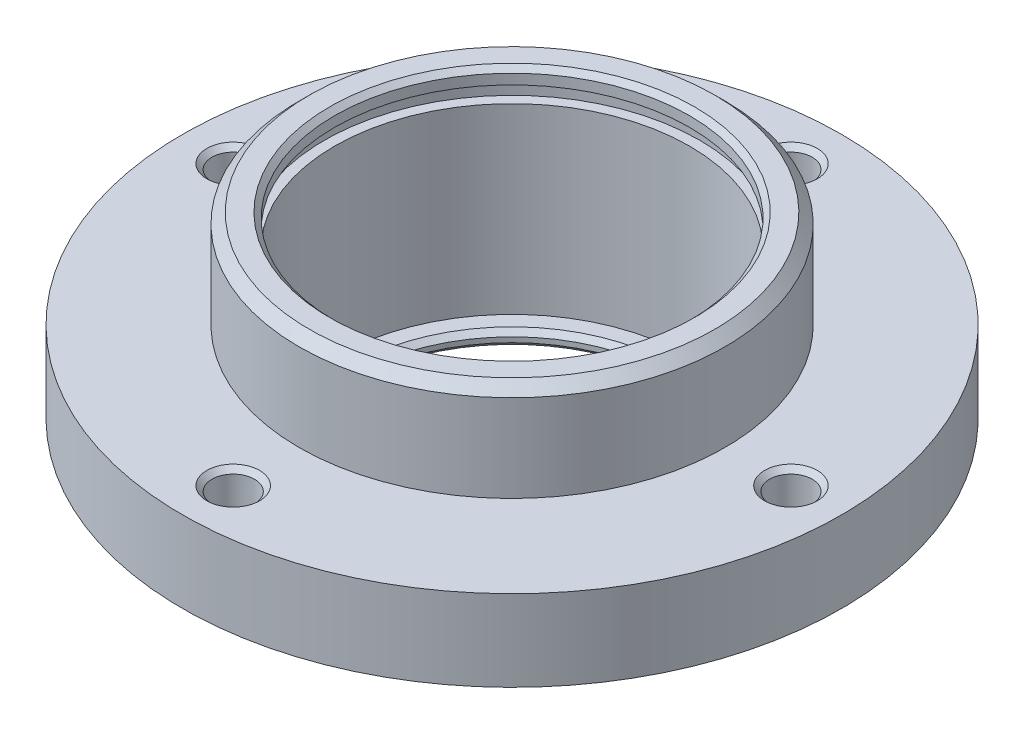
ISO-10303-21;
HEADER;
FILE_DESCRIPTION(('STEP AP214'),'2;1');
FILE_NAME('part.step','',(''),(''),'','','');
FILE_SCHEMA(('AUTOMOTIVE_DESIGN { 1 0 10303 214 1 1 1 1 }'));
ENDSEC;
DATA;
#1=APPLICATION_CONTEXT('core data for automotive mechanical design processes');
#2=APPLICATION_PROTOCOL_DEFINITION('international standard','automotive_design',2000,#1);
#3=PRODUCT_CONTEXT('',#1,'mechanical');
#4=PRODUCT('Part','Part','',(#3));
#5=PRODUCT_RELATED_PRODUCT_CATEGORY('part','',(#4));
#6=PRODUCT_DEFINITION_FORMATION('','',#4);
#7=PRODUCT_DEFINITION_CONTEXT('part definition',#1,'design');
#8=PRODUCT_DEFINITION('design','',#6,#7);
#9=PRODUCT_DEFINITION_SHAPE('','',#8);
#10=(LENGTH_UNIT() NAMED_UNIT(*) SI_UNIT(.MILLI.,.METRE.));
#11=(NAMED_UNIT(*) PLANE_ANGLE_UNIT() SI_UNIT($,.RADIAN.));
#12=(NAMED_UNIT(*) SI_UNIT($,.STERADIAN.) SOLID_ANGLE_UNIT());
#13=UNCERTAINTY_MEASURE_WITH_UNIT(LENGTH_MEASURE(1.E-05),#10,'distance_accuracy_value','');
#14=(GEOMETRIC_REPRESENTATION_CONTEXT(3) GLOBAL_UNCERTAINTY_ASSIGNED_CONTEXT((#13)) GLOBAL_UNIT_ASSIGNED_CONTEXT((#10,
#11,#12)) REPRESENTATION_CONTEXT('',''));
#15=CARTESIAN_POINT('',(0.,0.,0.));
#16=DIRECTION('',(0.,0.,1.));
#17=DIRECTION('',(1.,0.,0.));
#18=AXIS2_PLACEMENT_3D('',#15,#16,#17);
#19=CARTESIAN_POINT('',(0.,22.6,0.));
#20=DIRECTION('',(0.,-1.,0.));
#21=DIRECTION('',(0.,0.,-1.));
#22=AXIS2_PLACEMENT_3D('',#19,#20,#21);
#23=CONICAL_SURFACE('',#22,20.,0.785398163397447);
#24=CARTESIAN_POINT('',(0.,21.6,0.));
#25=DIRECTION('',(0.,-1.,0.));
#26=DIRECTION('',(0.,0.,-1.));
#27=AXIS2_PLACEMENT_3D('',#24,#25,#26);
#28=CIRCLE('',#27,21.);
#29=CARTESIAN_POINT('',(0.,21.6,-21.));
#30=VERTEX_POINT('',#29);
#31=EDGE_CURVE('E145',#30,#30,#28,.T.);
#32=ORIENTED_EDGE('',*,*,#31,.F.);
#33=EDGE_LOOP('',(#32));
#34=FACE_BOUND('',#33,.T.);
#35=CARTESIAN_POINT('',(0.,22.6,0.));
#36=DIRECTION('',(0.,-1.,0.));
#37=DIRECTION('',(0.,0.,-1.));
#38=AXIS2_PLACEMENT_3D('',#35,#36,#37);
#39=CIRCLE('',#38,20.);
#40=CARTESIAN_POINT('',(0.,22.6,-20.));
#41=VERTEX_POINT('',#40);
#42=EDGE_CURVE('E109',#41,#41,#39,.T.);
#43=ORIENTED_EDGE('',*,*,#42,.T.);
#44=EDGE_LOOP('',(#43));
#45=FACE_BOUND('',#44,.T.);
#46=ADVANCED_FACE('F35',(#34,#45),#23,.T.);
#47=CARTESIAN_POINT('',(-20.,22.6,0.));
#48=DIRECTION('',(0.,-1.,0.));
#49=DIRECTION('',(0.,0.,-1.));
#50=AXIS2_PLACEMENT_3D('',#47,#48,#49);
#51=PLANE('',#50);
#52=CARTESIAN_POINT('',(0.,22.6,0.));
#53=DIRECTION('',(0.,-1.,0.));
#54=DIRECTION('',(0.,0.,-1.));
#55=AXIS2_PLACEMENT_3D('',#52,#53,#54);
#56=CIRCLE('',#55,18.);
#57=CARTESIAN_POINT('',(0.,22.6,-18.));
#58=VERTEX_POINT('',#57);
#59=EDGE_CURVE('E94',#58,#58,#56,.T.);
#60=ORIENTED_EDGE('',*,*,#59,.T.);
#61=EDGE_LOOP('',(#60));
#62=FACE_BOUND('',#61,.T.);
#63=ORIENTED_EDGE('',*,*,#42,.F.);
#64=EDGE_LOOP('',(#63));
#65=FACE_BOUND('',#64,.T.);
#66=ADVANCED_FACE('F153',(#62,#65),#51,.F.);
#67=CARTESIAN_POINT('',(0.,0.,0.));
#68=DIRECTION('',(0.,-1.,0.));
#69=DIRECTION('',(0.,0.,-1.));
#70=AXIS2_PLACEMENT_3D('',#67,#68,#69);
#71=CYLINDRICAL_SURFACE('',#70,17.5);
#72=CARTESIAN_POINT('',(0.,22.1,0.));
#73=DIRECTION('',(0.,-1.,0.));
#74=DIRECTION('',(0.,0.,-1.));
#75=AXIS2_PLACEMENT_3D('',#72,#73,#74);
#76=CIRCLE('',#75,17.5);
#77=CARTESIAN_POINT('',(0.,22.1,-17.5));
#78=VERTEX_POINT('',#77);
#79=EDGE_CURVE('E91',#78,#78,#76,.F.);
#80=ORIENTED_EDGE('',*,*,#79,.T.);
#81=EDGE_LOOP('',(#80));
#82=FACE_BOUND('',#81,.T.);
#83=CARTESIAN_POINT('',(0.,21.1,0.));
#84=DIRECTION('',(0.,-1.,0.));
#85=DIRECTION('',(0.,0.,-1.));
#86=AXIS2_PLACEMENT_3D('',#83,#84,#85);
#87=CIRCLE('',#86,17.5);
#88=CARTESIAN_POINT('',(0.,21.1,-17.5));
#89=VERTEX_POINT('',#88);
#90=EDGE_CURVE('E112',#89,#89,#87,.T.);
#91=ORIENTED_EDGE('',*,*,#90,.T.);
#92=EDGE_LOOP('',(#91));
#93=FACE_BOUND('',#92,.T.);
#94=ADVANCED_FACE('F158',(#82,#93),#71,.F.);
#95=CARTESIAN_POINT('',(-17.5,21.1,0.));
#96=DIRECTION('',(0.,1.,0.));
#97=DIRECTION('',(0.,0.,1.));
#98=AXIS2_PLACEMENT_3D('',#95,#96,#97);
#99=PLANE('',#98);
#100=ORIENTED_EDGE('',*,*,#90,.F.);
#101=EDGE_LOOP('',(#100));
#102=FACE_BOUND('',#101,.T.);
#103=CARTESIAN_POINT('',(0.,21.1,0.));
#104=DIRECTION('',(0.,-1.,0.));
#105=DIRECTION('',(0.,0.,-1.));
#106=AXIS2_PLACEMENT_3D('',#103,#104,#105);
#107=CIRCLE('',#106,18.5);
#108=CARTESIAN_POINT('',(0.,21.1,-18.5));
#109=VERTEX_POINT('',#108);
#110=EDGE_CURVE('E115',#109,#109,#107,.T.);
#111=ORIENTED_EDGE('',*,*,#110,.T.);
#112=EDGE_LOOP('',(#111));
#113=FACE_BOUND('',#112,.T.);
#114=ADVANCED_FACE('F164',(#102,#113),#99,.F.);
#115=CARTESIAN_POINT('',(0.,0.,0.));
#116=DIRECTION('',(0.,-1.,0.));
#117=DIRECTION('',(0.,0.,-1.));
#118=AXIS2_PLACEMENT_3D('',#115,#116,#117);
#119=CYLINDRICAL_SURFACE('',#118,18.5);
#120=ORIENTED_EDGE('',*,*,#110,.F.);
#121=EDGE_LOOP('',(#120));
#122=FACE_BOUND('',#121,.T.);
#123=CARTESIAN_POINT('',(0.,19.5,0.));
#124=DIRECTION('',(0.,-1.,0.));
#125=DIRECTION('',(0.,0.,-1.));
#126=AXIS2_PLACEMENT_3D('',#123,#124,#125);
#127=CIRCLE('',#126,18.5);
#128=CARTESIAN_POINT('',(0.,19.5,-18.5));
#129=VERTEX_POINT('',#128);
#130=EDGE_CURVE('E118',#129,#129,#127,.T.);
#131=ORIENTED_EDGE('',*,*,#130,.T.);
#132=EDGE_LOOP('',(#131));
#133=FACE_BOUND('',#132,.T.);
#134=ADVANCED_FACE('F270',(#122,#133),#119,.F.);
#135=CARTESIAN_POINT('',(-17.5,19.5,0.));
#136=DIRECTION('',(0.,-1.,0.));
#137=DIRECTION('',(0.,0.,-1.));
#138=AXIS2_PLACEMENT_3D('',#135,#136,#137);
#139=PLANE('',#138);
#140=ORIENTED_EDGE('',*,*,#130,.F.);
#141=EDGE_LOOP('',(#140));
#142=FACE_BOUND('',#141,.T.);
#143=CARTESIAN_POINT('',(0.,19.5,0.));
#144=DIRECTION('',(0.,-1.,0.));
#145=DIRECTION('',(0.,0.,-1.));
#146=AXIS2_PLACEMENT_3D('',#143,#144,#145);
#147=CIRCLE('',#146,17.5);
#148=CARTESIAN_POINT('',(0.,19.5,-17.5));
#149=VERTEX_POINT('',#148);
#150=EDGE_CURVE('E121',#149,#149,#147,.T.);
#151=ORIENTED_EDGE('',*,*,#150,.T.);
#152=EDGE_LOOP('',(#151));
#153=FACE_BOUND('',#152,.T.);
#154=ADVANCED_FACE('F266',(#142,#153),#139,.F.);
#155=CARTESIAN_POINT('',(0.,0.,0.));
#156=DIRECTION('',(0.,-1.,0.));
#157=DIRECTION('',(0.,0.,-1.));
#158=AXIS2_PLACEMENT_3D('',#155,#156,#157);
#159=CYLINDRICAL_SURFACE('',#158,17.5);
#160=ORIENTED_EDGE('',*,*,#150,.F.);
#161=EDGE_LOOP('',(#160));
#162=FACE_BOUND('',#161,.T.);
#163=CARTESIAN_POINT('',(0.,1.5,0.));
#164=DIRECTION('',(0.,-1.,0.));
#165=DIRECTION('',(0.,0.,-1.));
#166=AXIS2_PLACEMENT_3D('',#163,#164,#165);
#167=CIRCLE('',#166,17.5);
#168=CARTESIAN_POINT('',(0.,1.5,-17.5));
#169=VERTEX_POINT('',#168);
#170=EDGE_CURVE('E124',#169,#169,#167,.T.);
#171=ORIENTED_EDGE('',*,*,#170,.T.);
#172=EDGE_LOOP('',(#171));
#173=FACE_BOUND('',#172,.T.);
#174=ADVANCED_FACE('F262',(#162,#173),#159,.F.);
#175=CARTESIAN_POINT('',(-17.5,1.5,0.));
#176=DIRECTION('',(0.,-1.,0.));
#177=DIRECTION('',(0.,0.,-1.));
#178=AXIS2_PLACEMENT_3D('',#175,#176,#177);
#179=PLANE('',#178);
#180=CARTESIAN_POINT('',(0.,1.5,0.));
#181=DIRECTION('',(0.,-1.,0.));
#182=DIRECTION('',(0.,0.,-1.));
#183=AXIS2_PLACEMENT_3D('',#180,#181,#182);
#184=CIRCLE('',#183,16.);
#185=CARTESIAN_POINT('',(0.,1.5,-16.));
#186=VERTEX_POINT('',#185);
#187=EDGE_CURVE('E97',#186,#186,#184,.T.);
#188=ORIENTED_EDGE('',*,*,#187,.T.);
#189=EDGE_LOOP('',(#188));
#190=FACE_BOUND('',#189,.T.);
#191=ORIENTED_EDGE('',*,*,#170,.F.);
#192=EDGE_LOOP('',(#191));
#193=FACE_BOUND('',#192,.T.);
#194=ADVANCED_FACE('F258',(#190,#193),#179,.F.);
#195=CARTESIAN_POINT('',(0.,0.,0.));
#196=DIRECTION('',(0.,-1.,0.));
#197=DIRECTION('',(0.,0.,-1.));
#198=AXIS2_PLACEMENT_3D('',#195,#196,#197);
#199=CYLINDRICAL_SURFACE('',#198,15.5);
#200=CARTESIAN_POINT('',(0.,0.500000000000023,0.));
#201=DIRECTION('',(0.,1.,0.));
#202=DIRECTION('',(0.,0.,1.));
#203=AXIS2_PLACEMENT_3D('',#200,#201,#202);
#204=CIRCLE('',#203,15.5);
#205=CARTESIAN_POINT('',(0.,0.500000000000023,15.5));
#206=VERTEX_POINT('',#205);
#207=EDGE_CURVE('E103',#206,#206,#204,.F.);
#208=ORIENTED_EDGE('',*,*,#207,.T.);
#209=EDGE_LOOP('',(#208));
#210=FACE_BOUND('',#209,.T.);
#211=CARTESIAN_POINT('',(0.,0.999999999999994,0.));
#212=DIRECTION('',(0.,-1.,0.));
#213=DIRECTION('',(0.,0.,-1.));
#214=AXIS2_PLACEMENT_3D('',#211,#212,#213);
#215=CIRCLE('',#214,15.5);
#216=CARTESIAN_POINT('',(0.,0.999999999999994,-15.5));
#217=VERTEX_POINT('',#216);
#218=EDGE_CURVE('E106',#217,#217,#215,.F.);
#219=ORIENTED_EDGE('',*,*,#218,.T.);
#220=EDGE_LOOP('',(#219));
#221=FACE_BOUND('',#220,.T.);
#222=ADVANCED_FACE('F254',(#210,#221),#199,.F.);
#223=CARTESIAN_POINT('',(-20.5,0.,0.));
#224=DIRECTION('',(0.,1.,0.));
#225=DIRECTION('',(0.,0.,1.));
#226=AXIS2_PLACEMENT_3D('',#223,#224,#225);
#227=PLANE('',#226);
#228=CARTESIAN_POINT('',(0.,0.,0.));
#229=DIRECTION('',(0.,1.,0.));
#230=DIRECTION('',(0.,0.,1.));
#231=AXIS2_PLACEMENT_3D('',#228,#229,#230);
#232=CIRCLE('',#231,16.);
#233=CARTESIAN_POINT('',(0.,0.,16.));
#234=VERTEX_POINT('',#233);
#235=EDGE_CURVE('E100',#234,#234,#232,.T.);
#236=ORIENTED_EDGE('',*,*,#235,.T.);
#237=EDGE_LOOP('',(#236));
#238=FACE_BOUND('',#237,.T.);
#239=CARTESIAN_POINT('',(0.,0.,0.));
#240=DIRECTION('',(0.,-1.,0.));
#241=DIRECTION('',(0.,0.,-1.));
#242=AXIS2_PLACEMENT_3D('',#239,#240,#241);
#243=CIRCLE('',#242,20.5);
#244=CARTESIAN_POINT('',(0.,0.,-20.5));
#245=VERTEX_POINT('',#244);
#246=EDGE_CURVE('E127',#245,#245,#243,.T.);
#247=ORIENTED_EDGE('',*,*,#246,.T.);
#248=EDGE_LOOP('',(#247));
#249=FACE_BOUND('',#248,.T.);
#250=ADVANCED_FACE('F250',(#238,#249),#227,.F.);
#251=CARTESIAN_POINT('',(0.,2.,0.));
#252=DIRECTION('',(0.,1.,0.));
#253=DIRECTION('',(0.,0.,1.));
#254=AXIS2_PLACEMENT_3D('',#251,#252,#253);
#255=CONICAL_SURFACE('',#254,22.5,0.785398163397449);
#256=ORIENTED_EDGE('',*,*,#246,.F.);
#257=EDGE_LOOP('',(#256));
#258=FACE_BOUND('',#257,.T.);
#259=CARTESIAN_POINT('',(0.,2.,0.));
#260=DIRECTION('',(0.,-1.,0.));
#261=DIRECTION('',(0.,0.,-1.));
#262=AXIS2_PLACEMENT_3D('',#259,#260,#261);
#263=CIRCLE('',#262,22.5);
#264=CARTESIAN_POINT('',(0.,2.,-22.5));
#265=VERTEX_POINT('',#264);
#266=EDGE_CURVE('E130',#265,#265,#263,.T.);
#267=ORIENTED_EDGE('',*,*,#266,.T.);
#268=EDGE_LOOP('',(#267));
#269=FACE_BOUND('',#268,.T.);
#270=ADVANCED_FACE('F246',(#258,#269),#255,.T.);
#271=CARTESIAN_POINT('',(0.,0.,0.));
#272=DIRECTION('',(0.,-1.,0.));
#273=DIRECTION('',(0.,0.,-1.));
#274=AXIS2_PLACEMENT_3D('',#271,#272,#273);
#275=CYLINDRICAL_SURFACE('',#274,22.5);
#276=ORIENTED_EDGE('',*,*,#266,.F.);
#277=EDGE_LOOP('',(#276));
#278=FACE_BOUND('',#277,.T.);
#279=CARTESIAN_POINT('',(0.,5.,0.));
#280=DIRECTION('',(0.,-1.,0.));
#281=DIRECTION('',(0.,0.,-1.));
#282=AXIS2_PLACEMENT_3D('',#279,#280,#281);
#283=CIRCLE('',#282,22.5);
#284=CARTESIAN_POINT('',(0.,5.,-22.5));
#285=VERTEX_POINT('',#284);
#286=EDGE_CURVE('E133',#285,#285,#283,.T.);
#287=ORIENTED_EDGE('',*,*,#286,.T.);
#288=EDGE_LOOP('',(#287));
#289=FACE_BOUND('',#288,.T.);
#290=ADVANCED_FACE('F242',(#278,#289),#275,.T.);
#291=CARTESIAN_POINT('',(-22.5,5.,0.));
#292=DIRECTION('',(0.,1.,0.));
#293=DIRECTION('',(0.,0.,1.));
#294=AXIS2_PLACEMENT_3D('',#291,#292,#293);
#295=PLANE('',#294);
#296=CARTESIAN_POINT('',(-27.5,5.,0.));
#297=DIRECTION('',(0.,1.,0.));
#298=DIRECTION('',(0.,0.,1.));
#299=AXIS2_PLACEMENT_3D('',#296,#297,#298);
#300=CIRCLE('',#299,2.6);
#301=CARTESIAN_POINT('',(-27.5,5.,2.6));
#302=VERTEX_POINT('',#301);
#303=EDGE_CURVE('E61',#302,#302,#300,.T.);
#304=ORIENTED_EDGE('',*,*,#303,.T.);
#305=EDGE_LOOP('',(#304));
#306=FACE_BOUND('',#305,.T.);
#307=CARTESIAN_POINT('',(0.,5.,-27.5));
#308=DIRECTION('',(0.,1.,0.));
#309=DIRECTION('',(0.,0.,1.));
#310=AXIS2_PLACEMENT_3D('',#307,#308,#309);
#311=CIRCLE('',#310,2.60000000000001);
#312=CARTESIAN_POINT('',(0.,5.,-24.9));
#313=VERTEX_POINT('',#312);
#314=EDGE_CURVE('E64',#313,#313,#311,.T.);
#315=ORIENTED_EDGE('',*,*,#314,.T.);
#316=EDGE_LOOP('',(#315));
#317=FACE_BOUND('',#316,.T.);
#318=CARTESIAN_POINT('',(0.,5.,27.5));
#319=DIRECTION('',(0.,1.,0.));
#320=DIRECTION('',(0.,0.,1.));
#321=AXIS2_PLACEMENT_3D('',#318,#319,#320);
#322=CIRCLE('',#321,2.60000000000001);
#323=CARTESIAN_POINT('',(0.,5.,30.1));
#324=VERTEX_POINT('',#323);
#325=EDGE_CURVE('E67',#324,#324,#322,.T.);
#326=ORIENTED_EDGE('',*,*,#325,.T.);
#327=EDGE_LOOP('',(#326));
#328=FACE_BOUND('',#327,.T.);
#329=CARTESIAN_POINT('',(27.5,5.,0.));
#330=DIRECTION('',(0.,1.,0.));
#331=DIRECTION('',(0.,0.,1.));
#332=AXIS2_PLACEMENT_3D('',#329,#330,#331);
#333=CIRCLE('',#332,2.60000000000002);
#334=CARTESIAN_POINT('',(27.5,5.,2.60000000000002));
#335=VERTEX_POINT('',#334);
#336=EDGE_CURVE('E70',#335,#335,#333,.T.);
#337=ORIENTED_EDGE('',*,*,#336,.T.);
#338=EDGE_LOOP('',(#337));
#339=FACE_BOUND('',#338,.T.);
#340=ORIENTED_EDGE('',*,*,#286,.F.);
#341=EDGE_LOOP('',(#340));
#342=FACE_BOUND('',#341,.T.);
#343=CARTESIAN_POINT('',(0.,5.,0.));
#344=DIRECTION('',(0.,-1.,0.));
#345=DIRECTION('',(0.,0.,-1.));
#346=AXIS2_PLACEMENT_3D('',#343,#344,#345);
#347=CIRCLE('',#346,32.5);
#348=CARTESIAN_POINT('',(0.,5.,-32.5));
#349=VERTEX_POINT('',#348);
#350=EDGE_CURVE('E136',#349,#349,#347,.T.);
#351=ORIENTED_EDGE('',*,*,#350,.T.);
#352=EDGE_LOOP('',(#351));
#353=FACE_BOUND('',#352,.T.);
#354=ADVANCED_FACE('F238',(#306,#317,#328,#339,#342,#353),#295,.F.);
#355=CARTESIAN_POINT('',(0.,0.,0.));
#356=DIRECTION('',(0.,-1.,0.));
#357=DIRECTION('',(0.,0.,-1.));
#358=AXIS2_PLACEMENT_3D('',#355,#356,#357);
#359=CYLINDRICAL_SURFACE('',#358,32.5);
#360=ORIENTED_EDGE('',*,*,#350,.F.);
#361=EDGE_LOOP('',(#360));
#362=FACE_BOUND('',#361,.T.);
#363=CARTESIAN_POINT('',(0.,13.,0.));
#364=DIRECTION('',(0.,-1.,0.));
#365=DIRECTION('',(0.,0.,-1.));
#366=AXIS2_PLACEMENT_3D('',#363,#364,#365);
#367=CIRCLE('',#366,32.5);
#368=CARTESIAN_POINT('',(0.,13.,-32.5));
#369=VERTEX_POINT('',#368);
#370=EDGE_CURVE('E139',#369,#369,#367,.T.);
#371=ORIENTED_EDGE('',*,*,#370,.T.);
#372=EDGE_LOOP('',(#371));
#373=FACE_BOUND('',#372,.T.);
#374=ADVANCED_FACE('F218',(#362,#373),#359,.T.);
#375=CARTESIAN_POINT('',(-21.,13.,0.));
#376=DIRECTION('',(0.,-1.,0.));
#377=DIRECTION('',(0.,0.,-1.));
#378=AXIS2_PLACEMENT_3D('',#375,#376,#377);
#379=PLANE('',#378);
#380=CARTESIAN_POINT('',(-27.5,13.,0.));
#381=DIRECTION('',(0.,-1.,0.));
#382=DIRECTION('',(0.,0.,-1.));
#383=AXIS2_PLACEMENT_3D('',#380,#381,#382);
#384=CIRCLE('',#383,2.60000000000002);
#385=CARTESIAN_POINT('',(-27.5,13.,-2.60000000000002));
#386=VERTEX_POINT('',#385);
#387=EDGE_CURVE('E79',#386,#386,#384,.T.);
#388=ORIENTED_EDGE('',*,*,#387,.T.);
#389=EDGE_LOOP('',(#388));
#390=FACE_BOUND('',#389,.T.);
#391=CARTESIAN_POINT('',(0.,13.,-27.5));
#392=DIRECTION('',(0.,-1.,0.));
#393=DIRECTION('',(0.,0.,-1.));
#394=AXIS2_PLACEMENT_3D('',#391,#392,#393);
#395=CIRCLE('',#394,2.59999999999999);
#396=CARTESIAN_POINT('',(0.,13.,-30.1));
#397=VERTEX_POINT('',#396);
#398=EDGE_CURVE('E82',#397,#397,#395,.T.);
#399=ORIENTED_EDGE('',*,*,#398,.T.);
#400=EDGE_LOOP('',(#399));
#401=FACE_BOUND('',#400,.T.);
#402=CARTESIAN_POINT('',(0.,13.,27.5));
#403=DIRECTION('',(0.,-1.,0.));
#404=DIRECTION('',(0.,0.,-1.));
#405=AXIS2_PLACEMENT_3D('',#402,#403,#404);
#406=CIRCLE('',#405,2.59999999999999);
#407=CARTESIAN_POINT('',(0.,13.,24.9));
#408=VERTEX_POINT('',#407);
#409=EDGE_CURVE('E85',#408,#408,#406,.T.);
#410=ORIENTED_EDGE('',*,*,#409,.T.);
#411=EDGE_LOOP('',(#410));
#412=FACE_BOUND('',#411,.T.);
#413=CARTESIAN_POINT('',(27.5,13.,0.));
#414=DIRECTION('',(0.,-1.,0.));
#415=DIRECTION('',(0.,0.,-1.));
#416=AXIS2_PLACEMENT_3D('',#413,#414,#415);
#417=CIRCLE('',#416,2.60000000000003);
#418=CARTESIAN_POINT('',(27.5,13.,-2.60000000000003));
#419=VERTEX_POINT('',#418);
#420=EDGE_CURVE('E88',#419,#419,#417,.T.);
#421=ORIENTED_EDGE('',*,*,#420,.T.);
#422=EDGE_LOOP('',(#421));
#423=FACE_BOUND('',#422,.T.);
#424=ORIENTED_EDGE('',*,*,#370,.F.);
#425=EDGE_LOOP('',(#424));
#426=FACE_BOUND('',#425,.T.);
#427=CARTESIAN_POINT('',(0.,13.,0.));
#428=DIRECTION('',(0.,-1.,0.));
#429=DIRECTION('',(0.,0.,-1.));
#430=AXIS2_PLACEMENT_3D('',#427,#428,#429);
#431=CIRCLE('',#430,21.);
#432=CARTESIAN_POINT('',(0.,13.,-21.));
#433=VERTEX_POINT('',#432);
#434=EDGE_CURVE('E142',#433,#433,#431,.T.);
#435=ORIENTED_EDGE('',*,*,#434,.T.);
#436=EDGE_LOOP('',(#435));
#437=FACE_BOUND('',#436,.T.);
#438=ADVANCED_FACE('F215',(#390,#401,#412,#423,#426,#437),#379,.F.);
#439=CARTESIAN_POINT('',(0.,0.,0.));
#440=DIRECTION('',(0.,-1.,0.));
#441=DIRECTION('',(0.,0.,-1.));
#442=AXIS2_PLACEMENT_3D('',#439,#440,#441);
#443=CYLINDRICAL_SURFACE('',#442,21.);
#444=ORIENTED_EDGE('',*,*,#434,.F.);
#445=EDGE_LOOP('',(#444));
#446=FACE_BOUND('',#445,.T.);
#447=ORIENTED_EDGE('',*,*,#31,.T.);
#448=EDGE_LOOP('',(#447));
#449=FACE_BOUND('',#448,.T.);
#450=ADVANCED_FACE('F149',(#446,#449),#443,.T.);
#451=CARTESIAN_POINT('',(0.,22.6,27.5));
#452=DIRECTION('',(0.,-1.,0.));
#453=DIRECTION('',(1.,0.,0.));
#454=AXIS2_PLACEMENT_3D('',#451,#452,#453);
#455=CYLINDRICAL_SURFACE('',#454,2.1);
#456=CARTESIAN_POINT('',(0.,12.5,27.5));
#457=DIRECTION('',(0.,-1.,0.));
#458=DIRECTION('',(1.,0.,0.));
#459=AXIS2_PLACEMENT_3D('',#456,#457,#458);
#460=CIRCLE('',#459,2.1);
#461=CARTESIAN_POINT('',(2.1,12.5,27.5));
#462=VERTEX_POINT('',#461);
#463=EDGE_CURVE('E46',#462,#462,#460,.F.);
#464=ORIENTED_EDGE('',*,*,#463,.T.);
#465=EDGE_LOOP('',(#464));
#466=FACE_BOUND('',#465,.T.);
#467=CARTESIAN_POINT('',(0.,5.5,27.5));
#468=DIRECTION('',(0.,1.,0.));
#469=DIRECTION('',(-1.,0.,0.));
#470=AXIS2_PLACEMENT_3D('',#467,#468,#469);
#471=CIRCLE('',#470,2.1);
#472=CARTESIAN_POINT('',(-2.1,5.5,27.5));
#473=VERTEX_POINT('',#472);
#474=EDGE_CURVE('E50',#473,#473,#471,.F.);
#475=ORIENTED_EDGE('',*,*,#474,.T.);
#476=EDGE_LOOP('',(#475));
#477=FACE_BOUND('',#476,.T.);
#478=ADVANCED_FACE('F226',(#466,#477),#455,.F.);
#479=CARTESIAN_POINT('',(27.5,22.6,0.));
#480=DIRECTION('',(0.,-1.,0.));
#481=DIRECTION('',(1.,0.,0.));
#482=AXIS2_PLACEMENT_3D('',#479,#480,#481);
#483=CYLINDRICAL_SURFACE('',#482,2.1);
#484=CARTESIAN_POINT('',(27.5,12.5,0.));
#485=DIRECTION('',(0.,-1.,0.));
#486=DIRECTION('',(0.,0.,-1.));
#487=AXIS2_PLACEMENT_3D('',#484,#485,#486);
#488=CIRCLE('',#487,2.1);
#489=CARTESIAN_POINT('',(27.5,12.5,-2.1));
#490=VERTEX_POINT('',#489);
#491=EDGE_CURVE('E10',#490,#490,#488,.F.);
#492=ORIENTED_EDGE('',*,*,#491,.T.);
#493=EDGE_LOOP('',(#492));
#494=FACE_BOUND('',#493,.T.);
#495=CARTESIAN_POINT('',(27.5,5.50000000000002,0.));
#496=DIRECTION('',(0.,1.,0.));
#497=DIRECTION('',(0.,0.,1.));
#498=AXIS2_PLACEMENT_3D('',#495,#496,#497);
#499=CIRCLE('',#498,2.1);
#500=CARTESIAN_POINT('',(27.5,5.50000000000002,2.1));
#501=VERTEX_POINT('',#500);
#502=EDGE_CURVE('E42',#501,#501,#499,.F.);
#503=ORIENTED_EDGE('',*,*,#502,.T.);
#504=EDGE_LOOP('',(#503));
#505=FACE_BOUND('',#504,.T.);
#506=ADVANCED_FACE('F231',(#494,#505),#483,.F.);
#507=CARTESIAN_POINT('',(0.,22.6,-27.5));
#508=DIRECTION('',(0.,-1.,0.));
#509=DIRECTION('',(1.,0.,0.));
#510=AXIS2_PLACEMENT_3D('',#507,#508,#509);
#511=CYLINDRICAL_SURFACE('',#510,2.1);
#512=CARTESIAN_POINT('',(0.,12.5,-27.5));
#513=DIRECTION('',(0.,-1.,0.));
#514=DIRECTION('',(1.,0.,0.));
#515=AXIS2_PLACEMENT_3D('',#512,#513,#514);
#516=CIRCLE('',#515,2.1);
#517=CARTESIAN_POINT('',(2.1,12.5,-27.5));
#518=VERTEX_POINT('',#517);
#519=EDGE_CURVE('E55',#518,#518,#516,.F.);
#520=ORIENTED_EDGE('',*,*,#519,.T.);
#521=EDGE_LOOP('',(#520));
#522=FACE_BOUND('',#521,.T.);
#523=CARTESIAN_POINT('',(0.,5.5,-27.5));
#524=DIRECTION('',(0.,1.,0.));
#525=DIRECTION('',(-1.,0.,0.));
#526=AXIS2_PLACEMENT_3D('',#523,#524,#525);
#527=CIRCLE('',#526,2.1);
#528=CARTESIAN_POINT('',(-2.1,5.5,-27.5));
#529=VERTEX_POINT('',#528);
#530=EDGE_CURVE('E58',#529,#529,#527,.F.);
#531=ORIENTED_EDGE('',*,*,#530,.T.);
#532=EDGE_LOOP('',(#531));
#533=FACE_BOUND('',#532,.T.);
#534=ADVANCED_FACE('F356',(#522,#533),#511,.F.);
#535=CARTESIAN_POINT('',(-27.5,22.6,0.));
#536=DIRECTION('',(0.,-1.,0.));
#537=DIRECTION('',(1.,0.,0.));
#538=AXIS2_PLACEMENT_3D('',#535,#536,#537);
#539=CYLINDRICAL_SURFACE('',#538,2.1);
#540=CARTESIAN_POINT('',(-27.5,12.5,0.));
#541=DIRECTION('',(0.,-1.,0.));
#542=DIRECTION('',(0.,0.,-1.));
#543=AXIS2_PLACEMENT_3D('',#540,#541,#542);
#544=CIRCLE('',#543,2.1);
#545=CARTESIAN_POINT('',(-27.5,12.5,-2.1));
#546=VERTEX_POINT('',#545);
#547=EDGE_CURVE('E73',#546,#546,#544,.F.);
#548=ORIENTED_EDGE('',*,*,#547,.T.);
#549=EDGE_LOOP('',(#548));
#550=FACE_BOUND('',#549,.T.);
#551=CARTESIAN_POINT('',(-27.5,5.49999999999999,0.));
#552=DIRECTION('',(0.,1.,0.));
#553=DIRECTION('',(0.,0.,1.));
#554=AXIS2_PLACEMENT_3D('',#551,#552,#553);
#555=CIRCLE('',#554,2.1);
#556=CARTESIAN_POINT('',(-27.5,5.49999999999999,2.1));
#557=VERTEX_POINT('',#556);
#558=EDGE_CURVE('E76',#557,#557,#555,.F.);
#559=ORIENTED_EDGE('',*,*,#558,.T.);
#560=EDGE_LOOP('',(#559));
#561=FACE_BOUND('',#560,.T.);
#562=ADVANCED_FACE('F173',(#550,#561),#539,.F.);
#563=CARTESIAN_POINT('',(0.,0.500000000000023,0.));
#564=DIRECTION('',(0.,-1.,0.));
#565=DIRECTION('',(0.,0.,-1.));
#566=AXIS2_PLACEMENT_3D('',#563,#564,#565);
#567=CONICAL_SURFACE('',#566,15.5,0.785398163397438);
#568=ORIENTED_EDGE('',*,*,#235,.F.);
#569=EDGE_LOOP('',(#568));
#570=FACE_BOUND('',#569,.T.);
#571=ORIENTED_EDGE('',*,*,#207,.F.);
#572=EDGE_LOOP('',(#571));
#573=FACE_BOUND('',#572,.T.);
#574=ADVANCED_FACE('F169',(#570,#573),#567,.F.);
#575=CARTESIAN_POINT('',(0.,1.5,0.));
#576=DIRECTION('',(0.,1.,0.));
#577=DIRECTION('',(0.,0.,1.));
#578=AXIS2_PLACEMENT_3D('',#575,#576,#577);
#579=CONICAL_SURFACE('',#578,16.,0.785398163397462);
#580=ORIENTED_EDGE('',*,*,#218,.F.);
#581=EDGE_LOOP('',(#580));
#582=FACE_BOUND('',#581,.T.);
#583=ORIENTED_EDGE('',*,*,#187,.F.);
#584=EDGE_LOOP('',(#583));
#585=FACE_BOUND('',#584,.T.);
#586=ADVANCED_FACE('F172',(#582,#585),#579,.F.);
#587=CARTESIAN_POINT('',(0.,22.6,0.));
#588=DIRECTION('',(0.,1.,0.));
#589=DIRECTION('',(0.,0.,1.));
#590=AXIS2_PLACEMENT_3D('',#587,#588,#589);
#591=CONICAL_SURFACE('',#590,18.,0.785398163397448);
#592=ORIENTED_EDGE('',*,*,#79,.F.);
#593=EDGE_LOOP('',(#592));
#594=FACE_BOUND('',#593,.T.);
#595=ORIENTED_EDGE('',*,*,#59,.F.);
#596=EDGE_LOOP('',(#595));
#597=FACE_BOUND('',#596,.T.);
#598=ADVANCED_FACE('F177',(#594,#597),#591,.F.);
#599=CARTESIAN_POINT('',(-27.5,13.,0.));
#600=DIRECTION('',(0.,1.,0.));
#601=DIRECTION('',(0.,0.,1.));
#602=AXIS2_PLACEMENT_3D('',#599,#600,#601);
#603=CONICAL_SURFACE('',#602,2.60000000000002,0.785398163397456);
#604=ORIENTED_EDGE('',*,*,#547,.F.);
#605=EDGE_LOOP('',(#604));
#606=FACE_BOUND('',#605,.T.);
#607=ORIENTED_EDGE('',*,*,#387,.F.);
#608=EDGE_LOOP('',(#607));
#609=FACE_BOUND('',#608,.T.);
#610=ADVANCED_FACE('F181',(#606,#609),#603,.F.);
#611=CARTESIAN_POINT('',(-27.5,5.49999999999999,0.));
#612=DIRECTION('',(0.,-1.,0.));
#613=DIRECTION('',(0.,0.,-1.));
#614=AXIS2_PLACEMENT_3D('',#611,#612,#613);
#615=CONICAL_SURFACE('',#614,2.1,0.785398163397464);
#616=ORIENTED_EDGE('',*,*,#303,.F.);
#617=EDGE_LOOP('',(#616));
#618=FACE_BOUND('',#617,.T.);
#619=ORIENTED_EDGE('',*,*,#558,.F.);
#620=EDGE_LOOP('',(#619));
#621=FACE_BOUND('',#620,.T.);
#622=ADVANCED_FACE('F185',(#618,#621),#615,.F.);
#623=CARTESIAN_POINT('',(0.,13.,-27.5));
#624=DIRECTION('',(0.,1.,0.));
#625=DIRECTION('',(-1.,0.,0.));
#626=AXIS2_PLACEMENT_3D('',#623,#624,#625);
#627=CONICAL_SURFACE('',#626,2.59999999999999,0.785398163397428);
#628=ORIENTED_EDGE('',*,*,#519,.F.);
#629=EDGE_LOOP('',(#628));
#630=FACE_BOUND('',#629,.T.);
#631=ORIENTED_EDGE('',*,*,#398,.F.);
#632=EDGE_LOOP('',(#631));
#633=FACE_BOUND('',#632,.T.);
#634=ADVANCED_FACE('F189',(#630,#633),#627,.F.);
#635=CARTESIAN_POINT('',(0.,5.5,-27.5));
#636=DIRECTION('',(0.,-1.,0.));
#637=DIRECTION('',(1.,0.,0.));
#638=AXIS2_PLACEMENT_3D('',#635,#636,#637);
#639=CONICAL_SURFACE('',#638,2.1,0.785398163397453);
#640=ORIENTED_EDGE('',*,*,#314,.F.);
#641=EDGE_LOOP('',(#640));
#642=FACE_BOUND('',#641,.T.);
#643=ORIENTED_EDGE('',*,*,#530,.F.);
#644=EDGE_LOOP('',(#643));
#645=FACE_BOUND('',#644,.T.);
#646=ADVANCED_FACE('F193',(#642,#645),#639,.F.);
#647=CARTESIAN_POINT('',(0.,13.,27.5));
#648=DIRECTION('',(0.,1.,0.));
#649=DIRECTION('',(-1.,0.,0.));
#650=AXIS2_PLACEMENT_3D('',#647,#648,#649);
#651=CONICAL_SURFACE('',#650,2.59999999999999,0.785398163397428);
#652=ORIENTED_EDGE('',*,*,#463,.F.);
#653=EDGE_LOOP('',(#652));
#654=FACE_BOUND('',#653,.T.);
#655=ORIENTED_EDGE('',*,*,#409,.F.);
#656=EDGE_LOOP('',(#655));
#657=FACE_BOUND('',#656,.T.);
#658=ADVANCED_FACE('F197',(#654,#657),#651,.F.);
#659=CARTESIAN_POINT('',(0.,5.5,27.5));
#660=DIRECTION('',(0.,-1.,0.));
#661=DIRECTION('',(1.,0.,0.));
#662=AXIS2_PLACEMENT_3D('',#659,#660,#661);
#663=CONICAL_SURFACE('',#662,2.1,0.785398163397453);
#664=ORIENTED_EDGE('',*,*,#325,.F.);
#665=EDGE_LOOP('',(#664));
#666=FACE_BOUND('',#665,.T.);
#667=ORIENTED_EDGE('',*,*,#474,.F.);
#668=EDGE_LOOP('',(#667));
#669=FACE_BOUND('',#668,.T.);
#670=ADVANCED_FACE('F201',(#666,#669),#663,.F.);
#671=CARTESIAN_POINT('',(27.5,13.,0.));
#672=DIRECTION('',(0.,1.,0.));
#673=DIRECTION('',(0.,0.,1.));
#674=AXIS2_PLACEMENT_3D('',#671,#672,#673);
#675=CONICAL_SURFACE('',#674,2.60000000000003,0.785398163397456);
#676=ORIENTED_EDGE('',*,*,#491,.F.);
#677=EDGE_LOOP('',(#676));
#678=FACE_BOUND('',#677,.T.);
#679=ORIENTED_EDGE('',*,*,#420,.F.);
#680=EDGE_LOOP('',(#679));
#681=FACE_BOUND('',#680,.T.);
#682=ADVANCED_FACE('F204',(#678,#681),#675,.F.);
#683=CARTESIAN_POINT('',(27.5,5.50000000000002,0.));
#684=DIRECTION('',(0.,-1.,0.));
#685=DIRECTION('',(0.,0.,-1.));
#686=AXIS2_PLACEMENT_3D('',#683,#684,#685);
#687=CONICAL_SURFACE('',#686,2.1,0.78539816339745);
#688=ORIENTED_EDGE('',*,*,#336,.F.);
#689=EDGE_LOOP('',(#688));
#690=FACE_BOUND('',#689,.T.);
#691=ORIENTED_EDGE('',*,*,#502,.F.);
#692=EDGE_LOOP('',(#691));
#693=FACE_BOUND('',#692,.T.);
#694=ADVANCED_FACE('F37',(#690,#693),#687,.F.);
#695=CLOSED_SHELL('',(#46,#66,#94,#114,#134,#154,#174,#194,#222,#250,#270,#290,#354,#374,#438,
#450,#478,#506,#534,#562,#574,#586,#598,#610,#622,#634,#646,#658,#670,#682,#694));
#696=MANIFOLD_SOLID_BREP('B2',#695);
#697=ADVANCED_BREP_SHAPE_REPRESENTATION('',(#18,#696),#14);
#698=SHAPE_DEFINITION_REPRESENTATION(#9,#697);
ENDSEC;
END-ISO-10303-21;
